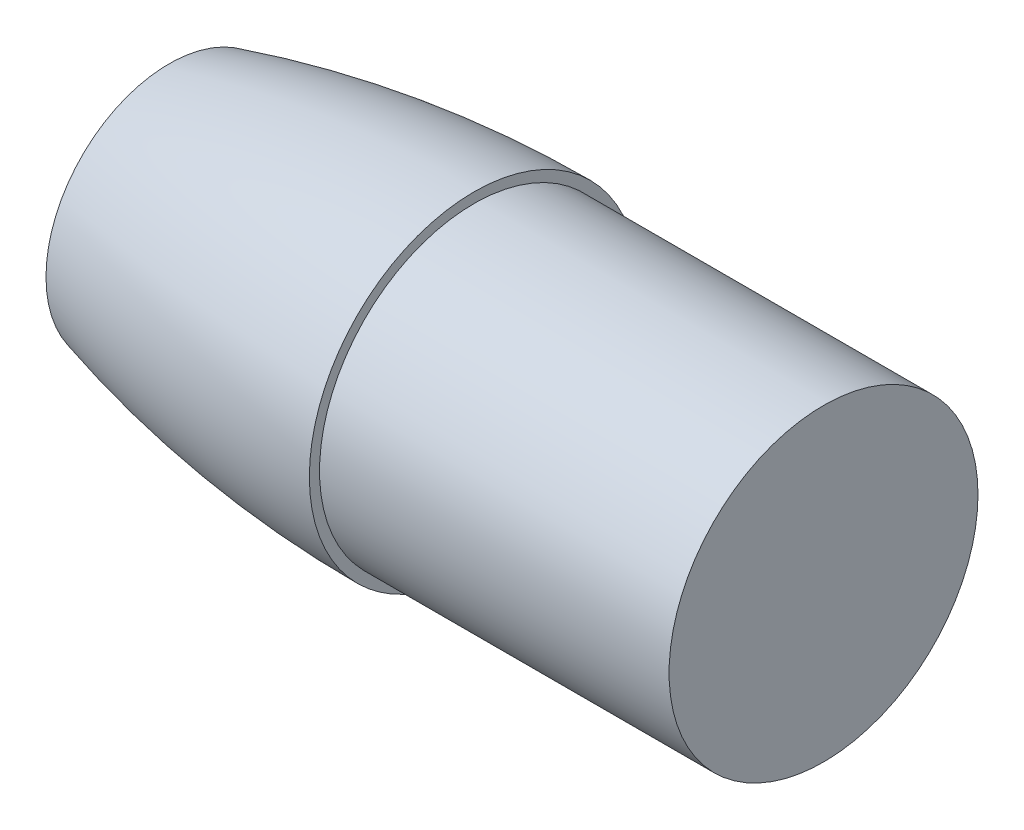
ISO-10303-21;
HEADER;
FILE_DESCRIPTION(('STEP AP214'),'2;1');
FILE_NAME('part.step','',(''),(''),'','','');
FILE_SCHEMA(('AUTOMOTIVE_DESIGN { 1 0 10303 214 1 1 1 1 }'));
ENDSEC;
DATA;
#1=APPLICATION_CONTEXT('core data for automotive mechanical design processes');
#2=APPLICATION_PROTOCOL_DEFINITION('international standard','automotive_design',2000,#1);
#3=PRODUCT_CONTEXT('',#1,'mechanical');
#4=PRODUCT('Part','Part','',(#3));
#5=PRODUCT_RELATED_PRODUCT_CATEGORY('part','',(#4));
#6=PRODUCT_DEFINITION_FORMATION('','',#4);
#7=PRODUCT_DEFINITION_CONTEXT('part definition',#1,'design');
#8=PRODUCT_DEFINITION('design','',#6,#7);
#9=PRODUCT_DEFINITION_SHAPE('','',#8);
#10=(LENGTH_UNIT() NAMED_UNIT(*) SI_UNIT(.MILLI.,.METRE.));
#11=(NAMED_UNIT(*) PLANE_ANGLE_UNIT() SI_UNIT($,.RADIAN.));
#12=(NAMED_UNIT(*) SI_UNIT($,.STERADIAN.) SOLID_ANGLE_UNIT());
#13=UNCERTAINTY_MEASURE_WITH_UNIT(LENGTH_MEASURE(1.E-05),#10,'distance_accuracy_value','');
#14=(GEOMETRIC_REPRESENTATION_CONTEXT(3) GLOBAL_UNCERTAINTY_ASSIGNED_CONTEXT((#13)) GLOBAL_UNIT_ASSIGNED_CONTEXT((#10,
#11,#12)) REPRESENTATION_CONTEXT('',''));
#15=CARTESIAN_POINT('',(0.,0.,0.));
#16=DIRECTION('',(0.,0.,1.));
#17=DIRECTION('',(1.,0.,0.));
#18=AXIS2_PLACEMENT_3D('',#15,#16,#17);
#19=CARTESIAN_POINT('',(0.,0.,0.));
#20=DIRECTION('',(1.,0.,0.));
#21=DIRECTION('',(0.,0.,-1.));
#22=AXIS2_PLACEMENT_3D('',#19,#20,#21);
#23=PLANE('',#22);
#24=CARTESIAN_POINT('',(0.,240.127906976744,0.));
#25=DIRECTION('',(1.,0.,0.));
#26=DIRECTION('',(0.,0.,-1.));
#27=AXIS2_PLACEMENT_3D('',#24,#25,#26);
#28=CIRCLE('',#27,40.4999999999999);
#29=CARTESIAN_POINT('',(0.,240.127906976744,-40.4999999999999));
#30=VERTEX_POINT('',#29);
#31=EDGE_CURVE('E10',#30,#30,#28,.T.);
#32=ORIENTED_EDGE('',*,*,#31,.T.);
#33=EDGE_LOOP('',(#32));
#34=FACE_BOUND('',#33,.T.);
#35=CARTESIAN_POINT('',(0.,240.127906976744,0.));
#36=DIRECTION('',(1.,0.,0.));
#37=DIRECTION('',(0.,0.,-1.));
#38=AXIS2_PLACEMENT_3D('',#35,#36,#37);
#39=CIRCLE('',#38,38.);
#40=CARTESIAN_POINT('',(0.,240.127906976744,-38.));
#41=VERTEX_POINT('',#40);
#42=EDGE_CURVE('E67',#41,#41,#39,.T.);
#43=ORIENTED_EDGE('',*,*,#42,.F.);
#44=EDGE_LOOP('',(#43));
#45=FACE_BOUND('',#44,.T.);
#46=ADVANCED_FACE('F39',(#34,#45),#23,.T.);
#47=CARTESIAN_POINT('',(0.,240.127906976744,0.));
#48=DIRECTION('',(1.,0.,0.));
#49=DIRECTION('',(0.,0.,-1.));
#50=AXIS2_PLACEMENT_3D('',#47,#48,#49);
#51=DEGENERATE_TOROIDAL_SURFACE('',#50,240.127906976744,280.627906976744,.F.);
#52=CARTESIAN_POINT('',(-75.,240.127906976744,0.));
#53=DIRECTION('',(1.,0.,0.));
#54=DIRECTION('',(0.,0.,-1.));
#55=AXIS2_PLACEMENT_3D('',#52,#53,#54);
#56=CIRCLE('',#55,30.2921776585288);
#57=CARTESIAN_POINT('',(-75.,240.127906976744,-30.2921776585288));
#58=VERTEX_POINT('',#57);
#59=EDGE_CURVE('E45',#58,#58,#56,.T.);
#60=ORIENTED_EDGE('',*,*,#59,.T.);
#61=EDGE_LOOP('',(#60));
#62=FACE_BOUND('',#61,.T.);
#63=ORIENTED_EDGE('',*,*,#31,.F.);
#64=EDGE_LOOP('',(#63));
#65=FACE_BOUND('',#64,.T.);
#66=ADVANCED_FACE('F75',(#62,#65),#51,.F.);
#67=CARTESIAN_POINT('',(-75.,0.,0.));
#68=DIRECTION('',(1.,0.,0.));
#69=DIRECTION('',(0.,0.,-1.));
#70=AXIS2_PLACEMENT_3D('',#67,#68,#69);
#71=PLANE('',#70);
#72=ORIENTED_EDGE('',*,*,#59,.F.);
#73=EDGE_LOOP('',(#72));
#74=FACE_BOUND('',#73,.T.);
#75=CARTESIAN_POINT('',(-75.,240.127906976744,0.));
#76=DIRECTION('',(1.,0.,0.));
#77=DIRECTION('',(0.,0.,-1.));
#78=AXIS2_PLACEMENT_3D('',#75,#76,#77);
#79=CIRCLE('',#78,27.6969100945356);
#80=CARTESIAN_POINT('',(-75.,240.127906976744,-27.6969100945356));
#81=VERTEX_POINT('',#80);
#82=EDGE_CURVE('E49',#81,#81,#79,.T.);
#83=ORIENTED_EDGE('',*,*,#82,.T.);
#84=EDGE_LOOP('',(#83));
#85=FACE_BOUND('',#84,.T.);
#86=ADVANCED_FACE('F79',(#74,#85),#71,.F.);
#87=CARTESIAN_POINT('',(0.,240.127906976744,0.));
#88=DIRECTION('',(1.,0.,0.));
#89=DIRECTION('',(0.,0.,-1.));
#90=AXIS2_PLACEMENT_3D('',#87,#88,#89);
#91=DEGENERATE_TOROIDAL_SURFACE('',#90,240.127906976744,278.127906976744,.F.);
#92=ORIENTED_EDGE('',*,*,#82,.F.);
#93=EDGE_LOOP('',(#92));
#94=FACE_BOUND('',#93,.T.);
#95=CARTESIAN_POINT('',(-5.,240.127906976744,0.));
#96=DIRECTION('',(1.,0.,0.));
#97=DIRECTION('',(0.,0.,-1.));
#98=AXIS2_PLACEMENT_3D('',#95,#96,#97);
#99=CIRCLE('',#98,37.9550530176871);
#100=CARTESIAN_POINT('',(-5.,240.127906976744,-37.9550530176871));
#101=VERTEX_POINT('',#100);
#102=EDGE_CURVE('E53',#101,#101,#99,.T.);
#103=ORIENTED_EDGE('',*,*,#102,.T.);
#104=EDGE_LOOP('',(#103));
#105=FACE_BOUND('',#104,.T.);
#106=ADVANCED_FACE('F83',(#94,#105),#91,.T.);
#107=CARTESIAN_POINT('',(-5.,0.,0.));
#108=DIRECTION('',(1.,0.,0.));
#109=DIRECTION('',(0.,0.,-1.));
#110=AXIS2_PLACEMENT_3D('',#107,#108,#109);
#111=PLANE('',#110);
#112=ORIENTED_EDGE('',*,*,#102,.F.);
#113=EDGE_LOOP('',(#112));
#114=FACE_BOUND('',#113,.T.);
#115=CARTESIAN_POINT('',(-5.,240.127906976744,0.));
#116=DIRECTION('',(1.,0.,0.));
#117=DIRECTION('',(0.,0.,-1.));
#118=AXIS2_PLACEMENT_3D('',#115,#116,#117);
#119=CIRCLE('',#118,33.);
#120=CARTESIAN_POINT('',(-5.,240.127906976744,-33.));
#121=VERTEX_POINT('',#120);
#122=EDGE_CURVE('E58',#121,#121,#119,.T.);
#123=ORIENTED_EDGE('',*,*,#122,.T.);
#124=EDGE_LOOP('',(#123));
#125=FACE_BOUND('',#124,.T.);
#126=ADVANCED_FACE('F90',(#114,#125),#111,.F.);
#127=CARTESIAN_POINT('',(-150.,240.127906976744,0.));
#128=DIRECTION('',(1.,0.,0.));
#129=DIRECTION('',(0.,0.,-1.));
#130=AXIS2_PLACEMENT_3D('',#127,#128,#129);
#131=CYLINDRICAL_SURFACE('',#130,33.);
#132=ORIENTED_EDGE('',*,*,#122,.F.);
#133=EDGE_LOOP('',(#132));
#134=FACE_BOUND('',#133,.T.);
#135=CARTESIAN_POINT('',(81.,240.127906976744,0.));
#136=DIRECTION('',(1.,0.,0.));
#137=DIRECTION('',(0.,0.,-1.));
#138=AXIS2_PLACEMENT_3D('',#135,#136,#137);
#139=CIRCLE('',#138,33.);
#140=CARTESIAN_POINT('',(81.,240.127906976744,-33.));
#141=VERTEX_POINT('',#140);
#142=EDGE_CURVE('E61',#141,#141,#139,.T.);
#143=ORIENTED_EDGE('',*,*,#142,.T.);
#144=EDGE_LOOP('',(#143));
#145=FACE_BOUND('',#144,.T.);
#146=ADVANCED_FACE('F94',(#134,#145),#131,.F.);
#147=CARTESIAN_POINT('',(81.,0.,0.));
#148=DIRECTION('',(1.,0.,0.));
#149=DIRECTION('',(0.,0.,-1.));
#150=AXIS2_PLACEMENT_3D('',#147,#148,#149);
#151=PLANE('',#150);
#152=ORIENTED_EDGE('',*,*,#142,.F.);
#153=EDGE_LOOP('',(#152));
#154=FACE_BOUND('',#153,.T.);
#155=ADVANCED_FACE('F98',(#154),#151,.F.);
#156=CARTESIAN_POINT('',(86.,0.,0.));
#157=DIRECTION('',(1.,0.,0.));
#158=DIRECTION('',(0.,0.,-1.));
#159=AXIS2_PLACEMENT_3D('',#156,#157,#158);
#160=PLANE('',#159);
#161=CARTESIAN_POINT('',(86.,240.127906976744,0.));
#162=DIRECTION('',(1.,0.,0.));
#163=DIRECTION('',(0.,0.,-1.));
#164=AXIS2_PLACEMENT_3D('',#161,#162,#163);
#165=CIRCLE('',#164,38.);
#166=CARTESIAN_POINT('',(86.,240.127906976744,-38.));
#167=VERTEX_POINT('',#166);
#168=EDGE_CURVE('E64',#167,#167,#165,.T.);
#169=ORIENTED_EDGE('',*,*,#168,.T.);
#170=EDGE_LOOP('',(#169));
#171=FACE_BOUND('',#170,.T.);
#172=ADVANCED_FACE('F102',(#171),#160,.T.);
#173=CARTESIAN_POINT('',(-150.,240.127906976744,0.));
#174=DIRECTION('',(1.,0.,0.));
#175=DIRECTION('',(0.,0.,-1.));
#176=AXIS2_PLACEMENT_3D('',#173,#174,#175);
#177=CYLINDRICAL_SURFACE('',#176,38.);
#178=ORIENTED_EDGE('',*,*,#42,.T.);
#179=EDGE_LOOP('',(#178));
#180=FACE_BOUND('',#179,.T.);
#181=ORIENTED_EDGE('',*,*,#168,.F.);
#182=EDGE_LOOP('',(#181));
#183=FACE_BOUND('',#182,.T.);
#184=ADVANCED_FACE('F71',(#180,#183),#177,.T.);
#185=CLOSED_SHELL('',(#46,#66,#86,#106,#126,#146,#155,#172,#184));
#186=MANIFOLD_SOLID_BREP('B2',#185);
#187=ADVANCED_BREP_SHAPE_REPRESENTATION('',(#18,#186),#14);
#188=SHAPE_DEFINITION_REPRESENTATION(#9,#187);
ENDSEC;
END-ISO-10303-21;
